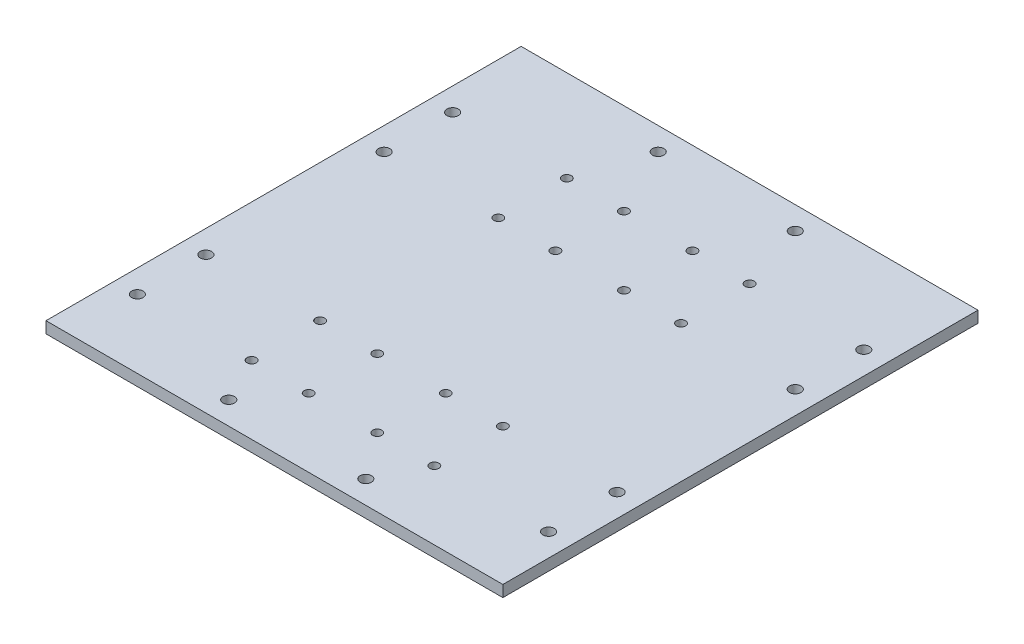
ISO-10303-21;
HEADER;
FILE_DESCRIPTION(('STEP AP214'),'2;1');
FILE_NAME('part.step','',(''),(''),'','','');
FILE_SCHEMA(('AUTOMOTIVE_DESIGN { 1 0 10303 214 1 1 1 1 }'));
ENDSEC;
DATA;
#1=APPLICATION_CONTEXT('core data for automotive mechanical design processes');
#2=APPLICATION_PROTOCOL_DEFINITION('international standard','automotive_design',2000,#1);
#3=PRODUCT_CONTEXT('',#1,'mechanical');
#4=PRODUCT('Part','Part','',(#3));
#5=PRODUCT_RELATED_PRODUCT_CATEGORY('part','',(#4));
#6=PRODUCT_DEFINITION_FORMATION('','',#4);
#7=PRODUCT_DEFINITION_CONTEXT('part definition',#1,'design');
#8=PRODUCT_DEFINITION('design','',#6,#7);
#9=PRODUCT_DEFINITION_SHAPE('','',#8);
#10=(LENGTH_UNIT() NAMED_UNIT(*) SI_UNIT(.MILLI.,.METRE.));
#11=(NAMED_UNIT(*) PLANE_ANGLE_UNIT() SI_UNIT($,.RADIAN.));
#12=(NAMED_UNIT(*) SI_UNIT($,.STERADIAN.) SOLID_ANGLE_UNIT());
#13=UNCERTAINTY_MEASURE_WITH_UNIT(LENGTH_MEASURE(1.E-05),#10,'distance_accuracy_value','');
#14=(GEOMETRIC_REPRESENTATION_CONTEXT(3) GLOBAL_UNCERTAINTY_ASSIGNED_CONTEXT((#13)) GLOBAL_UNIT_ASSIGNED_CONTEXT((#10,
#11,#12)) REPRESENTATION_CONTEXT('',''));
#15=CARTESIAN_POINT('',(0.,0.,0.));
#16=DIRECTION('',(0.,0.,1.));
#17=DIRECTION('',(1.,0.,0.));
#18=AXIS2_PLACEMENT_3D('',#15,#16,#17);
#19=CARTESIAN_POINT('',(0.,5.,0.));
#20=DIRECTION('',(1.,0.,0.));
#21=DIRECTION('',(0.,0.,-1.));
#22=AXIS2_PLACEMENT_3D('',#19,#20,#21);
#23=PLANE('',#22);
#24=DIRECTION('',(0.,0.,1.));
#25=VECTOR('',#24,1.);
#26=CARTESIAN_POINT('',(0.,0.,0.));
#27=LINE('',#26,#25);
#28=CARTESIAN_POINT('',(0.,0.,-208.));
#29=VERTEX_POINT('',#28);
#30=CARTESIAN_POINT('',(0.,0.,0.));
#31=VERTEX_POINT('',#30);
#32=EDGE_CURVE('E98',#29,#31,#27,.T.);
#33=ORIENTED_EDGE('',*,*,#32,.T.);
#34=DIRECTION('',(0.,-1.,0.));
#35=VECTOR('',#34,1.);
#36=CARTESIAN_POINT('',(0.,5.,0.));
#37=LINE('',#36,#35);
#38=CARTESIAN_POINT('',(0.,5.,0.));
#39=VERTEX_POINT('',#38);
#40=EDGE_CURVE('E11',#39,#31,#37,.T.);
#41=ORIENTED_EDGE('',*,*,#40,.F.);
#42=DIRECTION('',(0.,0.,1.));
#43=VECTOR('',#42,1.);
#44=CARTESIAN_POINT('',(0.,5.,0.));
#45=LINE('',#44,#43);
#46=CARTESIAN_POINT('',(0.,5.,-208.));
#47=VERTEX_POINT('',#46);
#48=EDGE_CURVE('E86',#47,#39,#45,.T.);
#49=ORIENTED_EDGE('',*,*,#48,.F.);
#50=DIRECTION('',(0.,-1.,0.));
#51=VECTOR('',#50,1.);
#52=CARTESIAN_POINT('',(0.,5.,-208.));
#53=LINE('',#52,#51);
#54=EDGE_CURVE('E94',#47,#29,#53,.T.);
#55=ORIENTED_EDGE('',*,*,#54,.T.);
#56=EDGE_LOOP('',(#33,#41,#49,#55));
#57=FACE_BOUND('',#56,.T.);
#58=ADVANCED_FACE('F35',(#57),#23,.F.);
#59=CARTESIAN_POINT('',(0.,5.,0.));
#60=DIRECTION('',(0.,0.,-1.));
#61=DIRECTION('',(-1.,0.,0.));
#62=AXIS2_PLACEMENT_3D('',#59,#60,#61);
#63=PLANE('',#62);
#64=DIRECTION('',(1.,0.,0.));
#65=VECTOR('',#64,1.);
#66=CARTESIAN_POINT('',(0.,0.,0.));
#67=LINE('',#66,#65);
#68=CARTESIAN_POINT('',(200.,0.,0.));
#69=VERTEX_POINT('',#68);
#70=EDGE_CURVE('E90',#31,#69,#67,.T.);
#71=ORIENTED_EDGE('',*,*,#70,.T.);
#72=DIRECTION('',(0.,-1.,0.));
#73=VECTOR('',#72,1.);
#74=CARTESIAN_POINT('',(200.,5.,0.));
#75=LINE('',#74,#73);
#76=CARTESIAN_POINT('',(200.,5.,0.));
#77=VERTEX_POINT('',#76);
#78=EDGE_CURVE('E43',#77,#69,#75,.T.);
#79=ORIENTED_EDGE('',*,*,#78,.F.);
#80=DIRECTION('',(1.,0.,0.));
#81=VECTOR('',#80,1.);
#82=CARTESIAN_POINT('',(0.,5.,0.));
#83=LINE('',#82,#81);
#84=EDGE_CURVE('E81',#39,#77,#83,.T.);
#85=ORIENTED_EDGE('',*,*,#84,.F.);
#86=ORIENTED_EDGE('',*,*,#40,.T.);
#87=EDGE_LOOP('',(#71,#79,#85,#86));
#88=FACE_BOUND('',#87,.T.);
#89=ADVANCED_FACE('F89',(#88),#63,.F.);
#90=CARTESIAN_POINT('',(200.,5.,0.));
#91=DIRECTION('',(-1.,0.,0.));
#92=DIRECTION('',(0.,0.,1.));
#93=AXIS2_PLACEMENT_3D('',#90,#91,#92);
#94=PLANE('',#93);
#95=DIRECTION('',(0.,0.,-1.));
#96=VECTOR('',#95,1.);
#97=CARTESIAN_POINT('',(200.,0.,0.));
#98=LINE('',#97,#96);
#99=CARTESIAN_POINT('',(200.,0.,-208.));
#100=VERTEX_POINT('',#99);
#101=EDGE_CURVE('E68',#69,#100,#98,.T.);
#102=ORIENTED_EDGE('',*,*,#101,.T.);
#103=DIRECTION('',(0.,-1.,0.));
#104=VECTOR('',#103,1.);
#105=CARTESIAN_POINT('',(200.,5.,-208.));
#106=LINE('',#105,#104);
#107=CARTESIAN_POINT('',(200.,5.,-208.));
#108=VERTEX_POINT('',#107);
#109=EDGE_CURVE('E91',#108,#100,#106,.T.);
#110=ORIENTED_EDGE('',*,*,#109,.F.);
#111=DIRECTION('',(0.,0.,-1.));
#112=VECTOR('',#111,1.);
#113=CARTESIAN_POINT('',(200.,5.,0.));
#114=LINE('',#113,#112);
#115=EDGE_CURVE('E84',#77,#108,#114,.T.);
#116=ORIENTED_EDGE('',*,*,#115,.F.);
#117=ORIENTED_EDGE('',*,*,#78,.T.);
#118=EDGE_LOOP('',(#102,#110,#116,#117));
#119=FACE_BOUND('',#118,.T.);
#120=ADVANCED_FACE('F92',(#119),#94,.F.);
#121=CARTESIAN_POINT('',(0.,5.,-208.));
#122=DIRECTION('',(0.,0.,1.));
#123=DIRECTION('',(1.,0.,0.));
#124=AXIS2_PLACEMENT_3D('',#121,#122,#123);
#125=PLANE('',#124);
#126=DIRECTION('',(-1.,0.,0.));
#127=VECTOR('',#126,1.);
#128=CARTESIAN_POINT('',(0.,0.,-208.));
#129=LINE('',#128,#127);
#130=EDGE_CURVE('E74',#100,#29,#129,.T.);
#131=ORIENTED_EDGE('',*,*,#130,.T.);
#132=ORIENTED_EDGE('',*,*,#54,.F.);
#133=DIRECTION('',(-1.,0.,0.));
#134=VECTOR('',#133,1.);
#135=CARTESIAN_POINT('',(0.,5.,-208.));
#136=LINE('',#135,#134);
#137=EDGE_CURVE('E51',#108,#47,#136,.T.);
#138=ORIENTED_EDGE('',*,*,#137,.F.);
#139=ORIENTED_EDGE('',*,*,#109,.T.);
#140=EDGE_LOOP('',(#131,#132,#138,#139));
#141=FACE_BOUND('',#140,.T.);
#142=ADVANCED_FACE('F106',(#141),#125,.F.);
#143=CARTESIAN_POINT('',(0.,5.,0.));
#144=DIRECTION('',(0.,-1.,0.));
#145=DIRECTION('',(0.,0.,-1.));
#146=AXIS2_PLACEMENT_3D('',#143,#144,#145);
#147=PLANE('',#146);
#148=CARTESIAN_POINT('',(10.,5.,-168.));
#149=DIRECTION('',(0.,1.,0.));
#150=DIRECTION('',(0.,0.,1.));
#151=AXIS2_PLACEMENT_3D('',#148,#149,#150);
#152=CIRCLE('',#151,2.5);
#153=CARTESIAN_POINT('',(10.,5.,-165.5));
#154=VERTEX_POINT('',#153);
#155=EDGE_CURVE('E276',#154,#154,#152,.T.);
#156=ORIENTED_EDGE('',*,*,#155,.F.);
#157=EDGE_LOOP('',(#156));
#158=FACE_BOUND('',#157,.T.);
#159=CARTESIAN_POINT('',(10.,5.,-138.));
#160=DIRECTION('',(0.,1.,0.));
#161=DIRECTION('',(0.,0.,1.));
#162=AXIS2_PLACEMENT_3D('',#159,#160,#161);
#163=CIRCLE('',#162,2.5);
#164=CARTESIAN_POINT('',(10.,5.,-135.5));
#165=VERTEX_POINT('',#164);
#166=EDGE_CURVE('E270',#165,#165,#163,.T.);
#167=ORIENTED_EDGE('',*,*,#166,.F.);
#168=EDGE_LOOP('',(#167));
#169=FACE_BOUND('',#168,.T.);
#170=CARTESIAN_POINT('',(10.,5.,-60.));
#171=DIRECTION('',(0.,1.,0.));
#172=DIRECTION('',(0.,0.,1.));
#173=AXIS2_PLACEMENT_3D('',#170,#171,#172);
#174=CIRCLE('',#173,2.5);
#175=CARTESIAN_POINT('',(10.,5.,-57.5));
#176=VERTEX_POINT('',#175);
#177=EDGE_CURVE('E264',#176,#176,#174,.T.);
#178=ORIENTED_EDGE('',*,*,#177,.F.);
#179=EDGE_LOOP('',(#178));
#180=FACE_BOUND('',#179,.T.);
#181=CARTESIAN_POINT('',(10.,5.,-30.));
#182=DIRECTION('',(0.,1.,0.));
#183=DIRECTION('',(0.,0.,1.));
#184=AXIS2_PLACEMENT_3D('',#181,#182,#183);
#185=CIRCLE('',#184,2.5);
#186=CARTESIAN_POINT('',(10.,5.,-27.5));
#187=VERTEX_POINT('',#186);
#188=EDGE_CURVE('E258',#187,#187,#185,.T.);
#189=ORIENTED_EDGE('',*,*,#188,.F.);
#190=EDGE_LOOP('',(#189));
#191=FACE_BOUND('',#190,.T.);
#192=CARTESIAN_POINT('',(70.,5.,-198.));
#193=DIRECTION('',(0.,1.,0.));
#194=DIRECTION('',(0.,0.,1.));
#195=AXIS2_PLACEMENT_3D('',#192,#193,#194);
#196=CIRCLE('',#195,2.5);
#197=CARTESIAN_POINT('',(70.,5.,-195.5));
#198=VERTEX_POINT('',#197);
#199=EDGE_CURVE('E252',#198,#198,#196,.T.);
#200=ORIENTED_EDGE('',*,*,#199,.F.);
#201=EDGE_LOOP('',(#200));
#202=FACE_BOUND('',#201,.T.);
#203=CARTESIAN_POINT('',(70.,5.,-10.));
#204=DIRECTION('',(0.,1.,0.));
#205=DIRECTION('',(0.,0.,1.));
#206=AXIS2_PLACEMENT_3D('',#203,#204,#205);
#207=CIRCLE('',#206,2.5);
#208=CARTESIAN_POINT('',(70.,5.,-7.5));
#209=VERTEX_POINT('',#208);
#210=EDGE_CURVE('E246',#209,#209,#207,.T.);
#211=ORIENTED_EDGE('',*,*,#210,.F.);
#212=EDGE_LOOP('',(#211));
#213=FACE_BOUND('',#212,.T.);
#214=CARTESIAN_POINT('',(130.,5.,-10.0000000000001));
#215=DIRECTION('',(0.,1.,0.));
#216=DIRECTION('',(0.,0.,1.));
#217=AXIS2_PLACEMENT_3D('',#214,#215,#216);
#218=CIRCLE('',#217,2.5);
#219=CARTESIAN_POINT('',(130.,5.,-7.50000000000011));
#220=VERTEX_POINT('',#219);
#221=EDGE_CURVE('E240',#220,#220,#218,.T.);
#222=ORIENTED_EDGE('',*,*,#221,.F.);
#223=EDGE_LOOP('',(#222));
#224=FACE_BOUND('',#223,.T.);
#225=CARTESIAN_POINT('',(130.,5.,-198.));
#226=DIRECTION('',(0.,1.,0.));
#227=DIRECTION('',(0.,0.,1.));
#228=AXIS2_PLACEMENT_3D('',#225,#226,#227);
#229=CIRCLE('',#228,2.5);
#230=CARTESIAN_POINT('',(130.,5.,-195.5));
#231=VERTEX_POINT('',#230);
#232=EDGE_CURVE('E234',#231,#231,#229,.T.);
#233=ORIENTED_EDGE('',*,*,#232,.F.);
#234=EDGE_LOOP('',(#233));
#235=FACE_BOUND('',#234,.T.);
#236=CARTESIAN_POINT('',(190.,5.,-30.));
#237=DIRECTION('',(0.,1.,0.));
#238=DIRECTION('',(0.,0.,1.));
#239=AXIS2_PLACEMENT_3D('',#236,#237,#238);
#240=CIRCLE('',#239,2.5);
#241=CARTESIAN_POINT('',(190.,5.,-27.5));
#242=VERTEX_POINT('',#241);
#243=EDGE_CURVE('E228',#242,#242,#240,.T.);
#244=ORIENTED_EDGE('',*,*,#243,.F.);
#245=EDGE_LOOP('',(#244));
#246=FACE_BOUND('',#245,.T.);
#247=CARTESIAN_POINT('',(190.,5.,-60.));
#248=DIRECTION('',(0.,1.,0.));
#249=DIRECTION('',(0.,0.,1.));
#250=AXIS2_PLACEMENT_3D('',#247,#248,#249);
#251=CIRCLE('',#250,2.5);
#252=CARTESIAN_POINT('',(190.,5.,-57.5));
#253=VERTEX_POINT('',#252);
#254=EDGE_CURVE('E222',#253,#253,#251,.T.);
#255=ORIENTED_EDGE('',*,*,#254,.F.);
#256=EDGE_LOOP('',(#255));
#257=FACE_BOUND('',#256,.T.);
#258=CARTESIAN_POINT('',(190.,5.,-138.));
#259=DIRECTION('',(0.,1.,0.));
#260=DIRECTION('',(0.,0.,1.));
#261=AXIS2_PLACEMENT_3D('',#258,#259,#260);
#262=CIRCLE('',#261,2.5);
#263=CARTESIAN_POINT('',(190.,5.,-135.5));
#264=VERTEX_POINT('',#263);
#265=EDGE_CURVE('E216',#264,#264,#262,.T.);
#266=ORIENTED_EDGE('',*,*,#265,.F.);
#267=EDGE_LOOP('',(#266));
#268=FACE_BOUND('',#267,.T.);
#269=CARTESIAN_POINT('',(190.,5.,-168.));
#270=DIRECTION('',(0.,1.,0.));
#271=DIRECTION('',(0.,0.,1.));
#272=AXIS2_PLACEMENT_3D('',#269,#270,#271);
#273=CIRCLE('',#272,2.5);
#274=CARTESIAN_POINT('',(190.,5.,-165.5));
#275=VERTEX_POINT('',#274);
#276=EDGE_CURVE('E210',#275,#275,#273,.T.);
#277=ORIENTED_EDGE('',*,*,#276,.F.);
#278=EDGE_LOOP('',(#277));
#279=FACE_BOUND('',#278,.T.);
#280=CARTESIAN_POINT('',(60.,5.,-168.));
#281=DIRECTION('',(0.,1.,0.));
#282=DIRECTION('',(0.,0.,1.));
#283=AXIS2_PLACEMENT_3D('',#280,#281,#282);
#284=CIRCLE('',#283,2.);
#285=CARTESIAN_POINT('',(60.,5.,-166.));
#286=VERTEX_POINT('',#285);
#287=EDGE_CURVE('E204',#286,#286,#284,.T.);
#288=ORIENTED_EDGE('',*,*,#287,.F.);
#289=EDGE_LOOP('',(#288));
#290=FACE_BOUND('',#289,.T.);
#291=CARTESIAN_POINT('',(85.,5.,-168.));
#292=DIRECTION('',(0.,1.,0.));
#293=DIRECTION('',(0.,0.,1.));
#294=AXIS2_PLACEMENT_3D('',#291,#292,#293);
#295=CIRCLE('',#294,2.);
#296=CARTESIAN_POINT('',(85.,5.,-166.));
#297=VERTEX_POINT('',#296);
#298=EDGE_CURVE('E198',#297,#297,#295,.T.);
#299=ORIENTED_EDGE('',*,*,#298,.F.);
#300=EDGE_LOOP('',(#299));
#301=FACE_BOUND('',#300,.T.);
#302=CARTESIAN_POINT('',(60.,5.,-138.));
#303=DIRECTION('',(0.,1.,0.));
#304=DIRECTION('',(0.,0.,1.));
#305=AXIS2_PLACEMENT_3D('',#302,#303,#304);
#306=CIRCLE('',#305,2.);
#307=CARTESIAN_POINT('',(60.,5.,-136.));
#308=VERTEX_POINT('',#307);
#309=EDGE_CURVE('E192',#308,#308,#306,.T.);
#310=ORIENTED_EDGE('',*,*,#309,.F.);
#311=EDGE_LOOP('',(#310));
#312=FACE_BOUND('',#311,.T.);
#313=CARTESIAN_POINT('',(85.,5.,-138.));
#314=DIRECTION('',(0.,1.,0.));
#315=DIRECTION('',(0.,0.,1.));
#316=AXIS2_PLACEMENT_3D('',#313,#314,#315);
#317=CIRCLE('',#316,2.);
#318=CARTESIAN_POINT('',(85.,5.,-136.));
#319=VERTEX_POINT('',#318);
#320=EDGE_CURVE('E186',#319,#319,#317,.T.);
#321=ORIENTED_EDGE('',*,*,#320,.F.);
#322=EDGE_LOOP('',(#321));
#323=FACE_BOUND('',#322,.T.);
#324=CARTESIAN_POINT('',(60.,5.,-60.));
#325=DIRECTION('',(0.,1.,0.));
#326=DIRECTION('',(0.,0.,1.));
#327=AXIS2_PLACEMENT_3D('',#324,#325,#326);
#328=CIRCLE('',#327,2.);
#329=CARTESIAN_POINT('',(60.,5.,-58.));
#330=VERTEX_POINT('',#329);
#331=EDGE_CURVE('E180',#330,#330,#328,.T.);
#332=ORIENTED_EDGE('',*,*,#331,.F.);
#333=EDGE_LOOP('',(#332));
#334=FACE_BOUND('',#333,.T.);
#335=CARTESIAN_POINT('',(85.,5.,-60.));
#336=DIRECTION('',(0.,1.,0.));
#337=DIRECTION('',(0.,0.,1.));
#338=AXIS2_PLACEMENT_3D('',#335,#336,#337);
#339=CIRCLE('',#338,2.);
#340=CARTESIAN_POINT('',(85.,5.,-58.));
#341=VERTEX_POINT('',#340);
#342=EDGE_CURVE('E174',#341,#341,#339,.T.);
#343=ORIENTED_EDGE('',*,*,#342,.F.);
#344=EDGE_LOOP('',(#343));
#345=FACE_BOUND('',#344,.T.);
#346=CARTESIAN_POINT('',(60.,5.,-30.));
#347=DIRECTION('',(0.,1.,0.));
#348=DIRECTION('',(0.,0.,1.));
#349=AXIS2_PLACEMENT_3D('',#346,#347,#348);
#350=CIRCLE('',#349,2.);
#351=CARTESIAN_POINT('',(60.,5.,-28.));
#352=VERTEX_POINT('',#351);
#353=EDGE_CURVE('E168',#352,#352,#350,.T.);
#354=ORIENTED_EDGE('',*,*,#353,.F.);
#355=EDGE_LOOP('',(#354));
#356=FACE_BOUND('',#355,.T.);
#357=CARTESIAN_POINT('',(85.,5.,-30.));
#358=DIRECTION('',(0.,1.,0.));
#359=DIRECTION('',(0.,0.,1.));
#360=AXIS2_PLACEMENT_3D('',#357,#358,#359);
#361=CIRCLE('',#360,2.);
#362=CARTESIAN_POINT('',(85.,5.,-28.));
#363=VERTEX_POINT('',#362);
#364=EDGE_CURVE('E162',#363,#363,#361,.T.);
#365=ORIENTED_EDGE('',*,*,#364,.F.);
#366=EDGE_LOOP('',(#365));
#367=FACE_BOUND('',#366,.T.);
#368=CARTESIAN_POINT('',(115.,5.,-30.0000000000001));
#369=DIRECTION('',(0.,1.,0.));
#370=DIRECTION('',(0.,0.,1.));
#371=AXIS2_PLACEMENT_3D('',#368,#369,#370);
#372=CIRCLE('',#371,2.);
#373=CARTESIAN_POINT('',(115.,5.,-28.0000000000001));
#374=VERTEX_POINT('',#373);
#375=EDGE_CURVE('E156',#374,#374,#372,.T.);
#376=ORIENTED_EDGE('',*,*,#375,.F.);
#377=EDGE_LOOP('',(#376));
#378=FACE_BOUND('',#377,.T.);
#379=CARTESIAN_POINT('',(140.,5.,-30.0000000000001));
#380=DIRECTION('',(0.,1.,0.));
#381=DIRECTION('',(0.,0.,1.));
#382=AXIS2_PLACEMENT_3D('',#379,#380,#381);
#383=CIRCLE('',#382,2.);
#384=CARTESIAN_POINT('',(140.,5.,-28.0000000000001));
#385=VERTEX_POINT('',#384);
#386=EDGE_CURVE('E150',#385,#385,#383,.T.);
#387=ORIENTED_EDGE('',*,*,#386,.F.);
#388=EDGE_LOOP('',(#387));
#389=FACE_BOUND('',#388,.T.);
#390=CARTESIAN_POINT('',(115.,5.,-60.0000000000001));
#391=DIRECTION('',(0.,1.,0.));
#392=DIRECTION('',(0.,0.,1.));
#393=AXIS2_PLACEMENT_3D('',#390,#391,#392);
#394=CIRCLE('',#393,2.);
#395=CARTESIAN_POINT('',(115.,5.,-58.0000000000001));
#396=VERTEX_POINT('',#395);
#397=EDGE_CURVE('E144',#396,#396,#394,.T.);
#398=ORIENTED_EDGE('',*,*,#397,.F.);
#399=EDGE_LOOP('',(#398));
#400=FACE_BOUND('',#399,.T.);
#401=CARTESIAN_POINT('',(140.,5.,-60.0000000000001));
#402=DIRECTION('',(0.,1.,0.));
#403=DIRECTION('',(0.,0.,1.));
#404=AXIS2_PLACEMENT_3D('',#401,#402,#403);
#405=CIRCLE('',#404,2.);
#406=CARTESIAN_POINT('',(140.,5.,-58.0000000000001));
#407=VERTEX_POINT('',#406);
#408=EDGE_CURVE('E138',#407,#407,#405,.T.);
#409=ORIENTED_EDGE('',*,*,#408,.F.);
#410=EDGE_LOOP('',(#409));
#411=FACE_BOUND('',#410,.T.);
#412=CARTESIAN_POINT('',(115.,5.,-138.));
#413=DIRECTION('',(0.,1.,0.));
#414=DIRECTION('',(0.,0.,1.));
#415=AXIS2_PLACEMENT_3D('',#412,#413,#414);
#416=CIRCLE('',#415,2.);
#417=CARTESIAN_POINT('',(115.,5.,-136.));
#418=VERTEX_POINT('',#417);
#419=EDGE_CURVE('E132',#418,#418,#416,.T.);
#420=ORIENTED_EDGE('',*,*,#419,.F.);
#421=EDGE_LOOP('',(#420));
#422=FACE_BOUND('',#421,.T.);
#423=CARTESIAN_POINT('',(140.,5.,-138.));
#424=DIRECTION('',(0.,1.,0.));
#425=DIRECTION('',(0.,0.,1.));
#426=AXIS2_PLACEMENT_3D('',#423,#424,#425);
#427=CIRCLE('',#426,2.);
#428=CARTESIAN_POINT('',(140.,5.,-136.));
#429=VERTEX_POINT('',#428);
#430=EDGE_CURVE('E126',#429,#429,#427,.T.);
#431=ORIENTED_EDGE('',*,*,#430,.F.);
#432=EDGE_LOOP('',(#431));
#433=FACE_BOUND('',#432,.T.);
#434=CARTESIAN_POINT('',(115.,5.,-168.));
#435=DIRECTION('',(0.,1.,0.));
#436=DIRECTION('',(0.,0.,1.));
#437=AXIS2_PLACEMENT_3D('',#434,#435,#436);
#438=CIRCLE('',#437,2.);
#439=CARTESIAN_POINT('',(115.,5.,-166.));
#440=VERTEX_POINT('',#439);
#441=EDGE_CURVE('E120',#440,#440,#438,.T.);
#442=ORIENTED_EDGE('',*,*,#441,.F.);
#443=EDGE_LOOP('',(#442));
#444=FACE_BOUND('',#443,.T.);
#445=CARTESIAN_POINT('',(140.,5.,-168.));
#446=DIRECTION('',(0.,1.,0.));
#447=DIRECTION('',(0.,0.,1.));
#448=AXIS2_PLACEMENT_3D('',#445,#446,#447);
#449=CIRCLE('',#448,2.);
#450=CARTESIAN_POINT('',(140.,5.,-166.));
#451=VERTEX_POINT('',#450);
#452=EDGE_CURVE('E114',#451,#451,#449,.T.);
#453=ORIENTED_EDGE('',*,*,#452,.F.);
#454=EDGE_LOOP('',(#453));
#455=FACE_BOUND('',#454,.T.);
#456=ORIENTED_EDGE('',*,*,#48,.T.);
#457=ORIENTED_EDGE('',*,*,#84,.T.);
#458=ORIENTED_EDGE('',*,*,#115,.T.);
#459=ORIENTED_EDGE('',*,*,#137,.T.);
#460=EDGE_LOOP('',(#456,#457,#458,#459));
#461=FACE_BOUND('',#460,.T.);
#462=ADVANCED_FACE('F82',(#158,#169,#180,#191,#202,#213,#224,#235,#246,#257,#268,#279,#290,#301,
#312,#323,#334,#345,#356,#367,#378,#389,#400,#411,#422,#433,#444,#455,#461),#147,.F.);
#463=CARTESIAN_POINT('',(0.,0.,0.));
#464=DIRECTION('',(0.,-1.,0.));
#465=DIRECTION('',(0.,0.,-1.));
#466=AXIS2_PLACEMENT_3D('',#463,#464,#465);
#467=PLANE('',#466);
#468=CARTESIAN_POINT('',(10.,0.,-168.));
#469=DIRECTION('',(0.,1.,0.));
#470=DIRECTION('',(0.,0.,1.));
#471=AXIS2_PLACEMENT_3D('',#468,#469,#470);
#472=CIRCLE('',#471,2.5);
#473=CARTESIAN_POINT('',(10.,0.,-165.5));
#474=VERTEX_POINT('',#473);
#475=EDGE_CURVE('E273',#474,#474,#472,.T.);
#476=ORIENTED_EDGE('',*,*,#475,.T.);
#477=EDGE_LOOP('',(#476));
#478=FACE_BOUND('',#477,.T.);
#479=CARTESIAN_POINT('',(10.,0.,-138.));
#480=DIRECTION('',(0.,1.,0.));
#481=DIRECTION('',(0.,0.,1.));
#482=AXIS2_PLACEMENT_3D('',#479,#480,#481);
#483=CIRCLE('',#482,2.5);
#484=CARTESIAN_POINT('',(10.,0.,-135.5));
#485=VERTEX_POINT('',#484);
#486=EDGE_CURVE('E267',#485,#485,#483,.T.);
#487=ORIENTED_EDGE('',*,*,#486,.T.);
#488=EDGE_LOOP('',(#487));
#489=FACE_BOUND('',#488,.T.);
#490=CARTESIAN_POINT('',(10.,0.,-60.));
#491=DIRECTION('',(0.,1.,0.));
#492=DIRECTION('',(0.,0.,1.));
#493=AXIS2_PLACEMENT_3D('',#490,#491,#492);
#494=CIRCLE('',#493,2.5);
#495=CARTESIAN_POINT('',(10.,0.,-57.5));
#496=VERTEX_POINT('',#495);
#497=EDGE_CURVE('E261',#496,#496,#494,.T.);
#498=ORIENTED_EDGE('',*,*,#497,.T.);
#499=EDGE_LOOP('',(#498));
#500=FACE_BOUND('',#499,.T.);
#501=CARTESIAN_POINT('',(10.,0.,-30.));
#502=DIRECTION('',(0.,1.,0.));
#503=DIRECTION('',(0.,0.,1.));
#504=AXIS2_PLACEMENT_3D('',#501,#502,#503);
#505=CIRCLE('',#504,2.5);
#506=CARTESIAN_POINT('',(10.,0.,-27.5));
#507=VERTEX_POINT('',#506);
#508=EDGE_CURVE('E255',#507,#507,#505,.T.);
#509=ORIENTED_EDGE('',*,*,#508,.T.);
#510=EDGE_LOOP('',(#509));
#511=FACE_BOUND('',#510,.T.);
#512=CARTESIAN_POINT('',(70.,0.,-198.));
#513=DIRECTION('',(0.,1.,0.));
#514=DIRECTION('',(0.,0.,1.));
#515=AXIS2_PLACEMENT_3D('',#512,#513,#514);
#516=CIRCLE('',#515,2.5);
#517=CARTESIAN_POINT('',(70.,0.,-195.5));
#518=VERTEX_POINT('',#517);
#519=EDGE_CURVE('E249',#518,#518,#516,.T.);
#520=ORIENTED_EDGE('',*,*,#519,.T.);
#521=EDGE_LOOP('',(#520));
#522=FACE_BOUND('',#521,.T.);
#523=CARTESIAN_POINT('',(70.,0.,-10.));
#524=DIRECTION('',(0.,1.,0.));
#525=DIRECTION('',(0.,0.,1.));
#526=AXIS2_PLACEMENT_3D('',#523,#524,#525);
#527=CIRCLE('',#526,2.5);
#528=CARTESIAN_POINT('',(70.,0.,-7.5));
#529=VERTEX_POINT('',#528);
#530=EDGE_CURVE('E243',#529,#529,#527,.T.);
#531=ORIENTED_EDGE('',*,*,#530,.T.);
#532=EDGE_LOOP('',(#531));
#533=FACE_BOUND('',#532,.T.);
#534=CARTESIAN_POINT('',(130.,0.,-10.0000000000001));
#535=DIRECTION('',(0.,1.,0.));
#536=DIRECTION('',(0.,0.,1.));
#537=AXIS2_PLACEMENT_3D('',#534,#535,#536);
#538=CIRCLE('',#537,2.5);
#539=CARTESIAN_POINT('',(130.,0.,-7.50000000000011));
#540=VERTEX_POINT('',#539);
#541=EDGE_CURVE('E237',#540,#540,#538,.T.);
#542=ORIENTED_EDGE('',*,*,#541,.T.);
#543=EDGE_LOOP('',(#542));
#544=FACE_BOUND('',#543,.T.);
#545=CARTESIAN_POINT('',(130.,0.,-198.));
#546=DIRECTION('',(0.,1.,0.));
#547=DIRECTION('',(0.,0.,1.));
#548=AXIS2_PLACEMENT_3D('',#545,#546,#547);
#549=CIRCLE('',#548,2.5);
#550=CARTESIAN_POINT('',(130.,0.,-195.5));
#551=VERTEX_POINT('',#550);
#552=EDGE_CURVE('E231',#551,#551,#549,.T.);
#553=ORIENTED_EDGE('',*,*,#552,.T.);
#554=EDGE_LOOP('',(#553));
#555=FACE_BOUND('',#554,.T.);
#556=CARTESIAN_POINT('',(190.,0.,-30.));
#557=DIRECTION('',(0.,1.,0.));
#558=DIRECTION('',(0.,0.,1.));
#559=AXIS2_PLACEMENT_3D('',#556,#557,#558);
#560=CIRCLE('',#559,2.5);
#561=CARTESIAN_POINT('',(190.,0.,-27.5));
#562=VERTEX_POINT('',#561);
#563=EDGE_CURVE('E225',#562,#562,#560,.T.);
#564=ORIENTED_EDGE('',*,*,#563,.T.);
#565=EDGE_LOOP('',(#564));
#566=FACE_BOUND('',#565,.T.);
#567=CARTESIAN_POINT('',(190.,0.,-60.));
#568=DIRECTION('',(0.,1.,0.));
#569=DIRECTION('',(0.,0.,1.));
#570=AXIS2_PLACEMENT_3D('',#567,#568,#569);
#571=CIRCLE('',#570,2.5);
#572=CARTESIAN_POINT('',(190.,0.,-57.5));
#573=VERTEX_POINT('',#572);
#574=EDGE_CURVE('E219',#573,#573,#571,.T.);
#575=ORIENTED_EDGE('',*,*,#574,.T.);
#576=EDGE_LOOP('',(#575));
#577=FACE_BOUND('',#576,.T.);
#578=CARTESIAN_POINT('',(190.,0.,-138.));
#579=DIRECTION('',(0.,1.,0.));
#580=DIRECTION('',(0.,0.,1.));
#581=AXIS2_PLACEMENT_3D('',#578,#579,#580);
#582=CIRCLE('',#581,2.5);
#583=CARTESIAN_POINT('',(190.,0.,-135.5));
#584=VERTEX_POINT('',#583);
#585=EDGE_CURVE('E213',#584,#584,#582,.T.);
#586=ORIENTED_EDGE('',*,*,#585,.T.);
#587=EDGE_LOOP('',(#586));
#588=FACE_BOUND('',#587,.T.);
#589=CARTESIAN_POINT('',(190.,0.,-168.));
#590=DIRECTION('',(0.,1.,0.));
#591=DIRECTION('',(0.,0.,1.));
#592=AXIS2_PLACEMENT_3D('',#589,#590,#591);
#593=CIRCLE('',#592,2.5);
#594=CARTESIAN_POINT('',(190.,0.,-165.5));
#595=VERTEX_POINT('',#594);
#596=EDGE_CURVE('E207',#595,#595,#593,.T.);
#597=ORIENTED_EDGE('',*,*,#596,.T.);
#598=EDGE_LOOP('',(#597));
#599=FACE_BOUND('',#598,.T.);
#600=CARTESIAN_POINT('',(60.,0.,-168.));
#601=DIRECTION('',(0.,1.,0.));
#602=DIRECTION('',(0.,0.,1.));
#603=AXIS2_PLACEMENT_3D('',#600,#601,#602);
#604=CIRCLE('',#603,2.);
#605=CARTESIAN_POINT('',(60.,0.,-166.));
#606=VERTEX_POINT('',#605);
#607=EDGE_CURVE('E201',#606,#606,#604,.T.);
#608=ORIENTED_EDGE('',*,*,#607,.T.);
#609=EDGE_LOOP('',(#608));
#610=FACE_BOUND('',#609,.T.);
#611=CARTESIAN_POINT('',(85.,0.,-168.));
#612=DIRECTION('',(0.,1.,0.));
#613=DIRECTION('',(0.,0.,1.));
#614=AXIS2_PLACEMENT_3D('',#611,#612,#613);
#615=CIRCLE('',#614,2.);
#616=CARTESIAN_POINT('',(85.,0.,-166.));
#617=VERTEX_POINT('',#616);
#618=EDGE_CURVE('E195',#617,#617,#615,.T.);
#619=ORIENTED_EDGE('',*,*,#618,.T.);
#620=EDGE_LOOP('',(#619));
#621=FACE_BOUND('',#620,.T.);
#622=CARTESIAN_POINT('',(60.,0.,-138.));
#623=DIRECTION('',(0.,1.,0.));
#624=DIRECTION('',(0.,0.,1.));
#625=AXIS2_PLACEMENT_3D('',#622,#623,#624);
#626=CIRCLE('',#625,2.);
#627=CARTESIAN_POINT('',(60.,0.,-136.));
#628=VERTEX_POINT('',#627);
#629=EDGE_CURVE('E189',#628,#628,#626,.T.);
#630=ORIENTED_EDGE('',*,*,#629,.T.);
#631=EDGE_LOOP('',(#630));
#632=FACE_BOUND('',#631,.T.);
#633=CARTESIAN_POINT('',(85.,0.,-138.));
#634=DIRECTION('',(0.,1.,0.));
#635=DIRECTION('',(0.,0.,1.));
#636=AXIS2_PLACEMENT_3D('',#633,#634,#635);
#637=CIRCLE('',#636,2.);
#638=CARTESIAN_POINT('',(85.,0.,-136.));
#639=VERTEX_POINT('',#638);
#640=EDGE_CURVE('E183',#639,#639,#637,.T.);
#641=ORIENTED_EDGE('',*,*,#640,.T.);
#642=EDGE_LOOP('',(#641));
#643=FACE_BOUND('',#642,.T.);
#644=CARTESIAN_POINT('',(60.,0.,-60.));
#645=DIRECTION('',(0.,1.,0.));
#646=DIRECTION('',(0.,0.,1.));
#647=AXIS2_PLACEMENT_3D('',#644,#645,#646);
#648=CIRCLE('',#647,2.);
#649=CARTESIAN_POINT('',(60.,0.,-58.));
#650=VERTEX_POINT('',#649);
#651=EDGE_CURVE('E177',#650,#650,#648,.T.);
#652=ORIENTED_EDGE('',*,*,#651,.T.);
#653=EDGE_LOOP('',(#652));
#654=FACE_BOUND('',#653,.T.);
#655=CARTESIAN_POINT('',(85.,0.,-60.));
#656=DIRECTION('',(0.,1.,0.));
#657=DIRECTION('',(0.,0.,1.));
#658=AXIS2_PLACEMENT_3D('',#655,#656,#657);
#659=CIRCLE('',#658,2.);
#660=CARTESIAN_POINT('',(85.,0.,-58.));
#661=VERTEX_POINT('',#660);
#662=EDGE_CURVE('E171',#661,#661,#659,.T.);
#663=ORIENTED_EDGE('',*,*,#662,.T.);
#664=EDGE_LOOP('',(#663));
#665=FACE_BOUND('',#664,.T.);
#666=CARTESIAN_POINT('',(60.,0.,-30.));
#667=DIRECTION('',(0.,1.,0.));
#668=DIRECTION('',(0.,0.,1.));
#669=AXIS2_PLACEMENT_3D('',#666,#667,#668);
#670=CIRCLE('',#669,2.);
#671=CARTESIAN_POINT('',(60.,0.,-28.));
#672=VERTEX_POINT('',#671);
#673=EDGE_CURVE('E165',#672,#672,#670,.T.);
#674=ORIENTED_EDGE('',*,*,#673,.T.);
#675=EDGE_LOOP('',(#674));
#676=FACE_BOUND('',#675,.T.);
#677=CARTESIAN_POINT('',(85.,0.,-30.));
#678=DIRECTION('',(0.,1.,0.));
#679=DIRECTION('',(0.,0.,1.));
#680=AXIS2_PLACEMENT_3D('',#677,#678,#679);
#681=CIRCLE('',#680,2.);
#682=CARTESIAN_POINT('',(85.,0.,-28.));
#683=VERTEX_POINT('',#682);
#684=EDGE_CURVE('E159',#683,#683,#681,.T.);
#685=ORIENTED_EDGE('',*,*,#684,.T.);
#686=EDGE_LOOP('',(#685));
#687=FACE_BOUND('',#686,.T.);
#688=CARTESIAN_POINT('',(115.,0.,-30.0000000000001));
#689=DIRECTION('',(0.,1.,0.));
#690=DIRECTION('',(0.,0.,1.));
#691=AXIS2_PLACEMENT_3D('',#688,#689,#690);
#692=CIRCLE('',#691,2.);
#693=CARTESIAN_POINT('',(115.,0.,-28.0000000000001));
#694=VERTEX_POINT('',#693);
#695=EDGE_CURVE('E153',#694,#694,#692,.T.);
#696=ORIENTED_EDGE('',*,*,#695,.T.);
#697=EDGE_LOOP('',(#696));
#698=FACE_BOUND('',#697,.T.);
#699=CARTESIAN_POINT('',(140.,0.,-30.0000000000001));
#700=DIRECTION('',(0.,1.,0.));
#701=DIRECTION('',(0.,0.,1.));
#702=AXIS2_PLACEMENT_3D('',#699,#700,#701);
#703=CIRCLE('',#702,2.);
#704=CARTESIAN_POINT('',(140.,0.,-28.0000000000001));
#705=VERTEX_POINT('',#704);
#706=EDGE_CURVE('E147',#705,#705,#703,.T.);
#707=ORIENTED_EDGE('',*,*,#706,.T.);
#708=EDGE_LOOP('',(#707));
#709=FACE_BOUND('',#708,.T.);
#710=CARTESIAN_POINT('',(115.,0.,-60.0000000000001));
#711=DIRECTION('',(0.,1.,0.));
#712=DIRECTION('',(0.,0.,1.));
#713=AXIS2_PLACEMENT_3D('',#710,#711,#712);
#714=CIRCLE('',#713,2.);
#715=CARTESIAN_POINT('',(115.,0.,-58.0000000000001));
#716=VERTEX_POINT('',#715);
#717=EDGE_CURVE('E141',#716,#716,#714,.T.);
#718=ORIENTED_EDGE('',*,*,#717,.T.);
#719=EDGE_LOOP('',(#718));
#720=FACE_BOUND('',#719,.T.);
#721=CARTESIAN_POINT('',(140.,0.,-60.0000000000001));
#722=DIRECTION('',(0.,1.,0.));
#723=DIRECTION('',(0.,0.,1.));
#724=AXIS2_PLACEMENT_3D('',#721,#722,#723);
#725=CIRCLE('',#724,2.);
#726=CARTESIAN_POINT('',(140.,0.,-58.0000000000001));
#727=VERTEX_POINT('',#726);
#728=EDGE_CURVE('E135',#727,#727,#725,.T.);
#729=ORIENTED_EDGE('',*,*,#728,.T.);
#730=EDGE_LOOP('',(#729));
#731=FACE_BOUND('',#730,.T.);
#732=CARTESIAN_POINT('',(115.,0.,-138.));
#733=DIRECTION('',(0.,1.,0.));
#734=DIRECTION('',(0.,0.,1.));
#735=AXIS2_PLACEMENT_3D('',#732,#733,#734);
#736=CIRCLE('',#735,2.);
#737=CARTESIAN_POINT('',(115.,0.,-136.));
#738=VERTEX_POINT('',#737);
#739=EDGE_CURVE('E129',#738,#738,#736,.T.);
#740=ORIENTED_EDGE('',*,*,#739,.T.);
#741=EDGE_LOOP('',(#740));
#742=FACE_BOUND('',#741,.T.);
#743=CARTESIAN_POINT('',(140.,0.,-138.));
#744=DIRECTION('',(0.,1.,0.));
#745=DIRECTION('',(0.,0.,1.));
#746=AXIS2_PLACEMENT_3D('',#743,#744,#745);
#747=CIRCLE('',#746,2.);
#748=CARTESIAN_POINT('',(140.,0.,-136.));
#749=VERTEX_POINT('',#748);
#750=EDGE_CURVE('E123',#749,#749,#747,.T.);
#751=ORIENTED_EDGE('',*,*,#750,.T.);
#752=EDGE_LOOP('',(#751));
#753=FACE_BOUND('',#752,.T.);
#754=CARTESIAN_POINT('',(115.,0.,-168.));
#755=DIRECTION('',(0.,1.,0.));
#756=DIRECTION('',(0.,0.,1.));
#757=AXIS2_PLACEMENT_3D('',#754,#755,#756);
#758=CIRCLE('',#757,2.);
#759=CARTESIAN_POINT('',(115.,0.,-166.));
#760=VERTEX_POINT('',#759);
#761=EDGE_CURVE('E117',#760,#760,#758,.T.);
#762=ORIENTED_EDGE('',*,*,#761,.T.);
#763=EDGE_LOOP('',(#762));
#764=FACE_BOUND('',#763,.T.);
#765=CARTESIAN_POINT('',(140.,0.,-168.));
#766=DIRECTION('',(0.,1.,0.));
#767=DIRECTION('',(0.,0.,1.));
#768=AXIS2_PLACEMENT_3D('',#765,#766,#767);
#769=CIRCLE('',#768,2.);
#770=CARTESIAN_POINT('',(140.,0.,-166.));
#771=VERTEX_POINT('',#770);
#772=EDGE_CURVE('E101',#771,#771,#769,.T.);
#773=ORIENTED_EDGE('',*,*,#772,.T.);
#774=EDGE_LOOP('',(#773));
#775=FACE_BOUND('',#774,.T.);
#776=ORIENTED_EDGE('',*,*,#32,.F.);
#777=ORIENTED_EDGE('',*,*,#130,.F.);
#778=ORIENTED_EDGE('',*,*,#101,.F.);
#779=ORIENTED_EDGE('',*,*,#70,.F.);
#780=EDGE_LOOP('',(#776,#777,#778,#779));
#781=FACE_BOUND('',#780,.T.);
#782=ADVANCED_FACE('F109',(#478,#489,#500,#511,#522,#533,#544,#555,#566,#577,#588,#599,#610,
#621,#632,#643,#654,#665,#676,#687,#698,#709,#720,#731,#742,#753,#764,#775,#781),#467,.T.);
#783=CARTESIAN_POINT('',(140.,5.,-168.));
#784=DIRECTION('',(0.,1.,0.));
#785=DIRECTION('',(0.,0.,1.));
#786=AXIS2_PLACEMENT_3D('',#783,#784,#785);
#787=CYLINDRICAL_SURFACE('',#786,2.);
#788=ORIENTED_EDGE('',*,*,#772,.F.);
#789=EDGE_LOOP('',(#788));
#790=FACE_BOUND('',#789,.T.);
#791=ORIENTED_EDGE('',*,*,#452,.T.);
#792=EDGE_LOOP('',(#791));
#793=FACE_BOUND('',#792,.T.);
#794=ADVANCED_FACE('F339',(#790,#793),#787,.F.);
#795=CARTESIAN_POINT('',(115.,5.,-168.));
#796=DIRECTION('',(0.,1.,0.));
#797=DIRECTION('',(0.,0.,1.));
#798=AXIS2_PLACEMENT_3D('',#795,#796,#797);
#799=CYLINDRICAL_SURFACE('',#798,2.);
#800=ORIENTED_EDGE('',*,*,#761,.F.);
#801=EDGE_LOOP('',(#800));
#802=FACE_BOUND('',#801,.T.);
#803=ORIENTED_EDGE('',*,*,#441,.T.);
#804=EDGE_LOOP('',(#803));
#805=FACE_BOUND('',#804,.T.);
#806=ADVANCED_FACE('F341',(#802,#805),#799,.F.);
#807=CARTESIAN_POINT('',(140.,5.,-138.));
#808=DIRECTION('',(0.,1.,0.));
#809=DIRECTION('',(0.,0.,1.));
#810=AXIS2_PLACEMENT_3D('',#807,#808,#809);
#811=CYLINDRICAL_SURFACE('',#810,2.);
#812=ORIENTED_EDGE('',*,*,#750,.F.);
#813=EDGE_LOOP('',(#812));
#814=FACE_BOUND('',#813,.T.);
#815=ORIENTED_EDGE('',*,*,#430,.T.);
#816=EDGE_LOOP('',(#815));
#817=FACE_BOUND('',#816,.T.);
#818=ADVANCED_FACE('F348',(#814,#817),#811,.F.);
#819=CARTESIAN_POINT('',(115.,5.,-138.));
#820=DIRECTION('',(0.,1.,0.));
#821=DIRECTION('',(0.,0.,1.));
#822=AXIS2_PLACEMENT_3D('',#819,#820,#821);
#823=CYLINDRICAL_SURFACE('',#822,2.);
#824=ORIENTED_EDGE('',*,*,#739,.F.);
#825=EDGE_LOOP('',(#824));
#826=FACE_BOUND('',#825,.T.);
#827=ORIENTED_EDGE('',*,*,#419,.T.);
#828=EDGE_LOOP('',(#827));
#829=FACE_BOUND('',#828,.T.);
#830=ADVANCED_FACE('F551',(#826,#829),#823,.F.);
#831=CARTESIAN_POINT('',(140.,5.,-60.0000000000001));
#832=DIRECTION('',(0.,1.,0.));
#833=DIRECTION('',(0.,0.,1.));
#834=AXIS2_PLACEMENT_3D('',#831,#832,#833);
#835=CYLINDRICAL_SURFACE('',#834,2.);
#836=ORIENTED_EDGE('',*,*,#728,.F.);
#837=EDGE_LOOP('',(#836));
#838=FACE_BOUND('',#837,.T.);
#839=ORIENTED_EDGE('',*,*,#408,.T.);
#840=EDGE_LOOP('',(#839));
#841=FACE_BOUND('',#840,.T.);
#842=ADVANCED_FACE('F547',(#838,#841),#835,.F.);
#843=CARTESIAN_POINT('',(115.,5.,-60.0000000000001));
#844=DIRECTION('',(0.,1.,0.));
#845=DIRECTION('',(0.,0.,1.));
#846=AXIS2_PLACEMENT_3D('',#843,#844,#845);
#847=CYLINDRICAL_SURFACE('',#846,2.);
#848=ORIENTED_EDGE('',*,*,#717,.F.);
#849=EDGE_LOOP('',(#848));
#850=FACE_BOUND('',#849,.T.);
#851=ORIENTED_EDGE('',*,*,#397,.T.);
#852=EDGE_LOOP('',(#851));
#853=FACE_BOUND('',#852,.T.);
#854=ADVANCED_FACE('F543',(#850,#853),#847,.F.);
#855=CARTESIAN_POINT('',(140.,5.,-30.0000000000001));
#856=DIRECTION('',(0.,1.,0.));
#857=DIRECTION('',(0.,0.,1.));
#858=AXIS2_PLACEMENT_3D('',#855,#856,#857);
#859=CYLINDRICAL_SURFACE('',#858,2.);
#860=ORIENTED_EDGE('',*,*,#706,.F.);
#861=EDGE_LOOP('',(#860));
#862=FACE_BOUND('',#861,.T.);
#863=ORIENTED_EDGE('',*,*,#386,.T.);
#864=EDGE_LOOP('',(#863));
#865=FACE_BOUND('',#864,.T.);
#866=ADVANCED_FACE('F539',(#862,#865),#859,.F.);
#867=CARTESIAN_POINT('',(115.,5.,-30.0000000000001));
#868=DIRECTION('',(0.,1.,0.));
#869=DIRECTION('',(0.,0.,1.));
#870=AXIS2_PLACEMENT_3D('',#867,#868,#869);
#871=CYLINDRICAL_SURFACE('',#870,2.);
#872=ORIENTED_EDGE('',*,*,#695,.F.);
#873=EDGE_LOOP('',(#872));
#874=FACE_BOUND('',#873,.T.);
#875=ORIENTED_EDGE('',*,*,#375,.T.);
#876=EDGE_LOOP('',(#875));
#877=FACE_BOUND('',#876,.T.);
#878=ADVANCED_FACE('F535',(#874,#877),#871,.F.);
#879=CARTESIAN_POINT('',(85.,5.,-30.));
#880=DIRECTION('',(0.,1.,0.));
#881=DIRECTION('',(0.,0.,1.));
#882=AXIS2_PLACEMENT_3D('',#879,#880,#881);
#883=CYLINDRICAL_SURFACE('',#882,2.);
#884=ORIENTED_EDGE('',*,*,#684,.F.);
#885=EDGE_LOOP('',(#884));
#886=FACE_BOUND('',#885,.T.);
#887=ORIENTED_EDGE('',*,*,#364,.T.);
#888=EDGE_LOOP('',(#887));
#889=FACE_BOUND('',#888,.T.);
#890=ADVANCED_FACE('F531',(#886,#889),#883,.F.);
#891=CARTESIAN_POINT('',(60.,5.,-30.));
#892=DIRECTION('',(0.,1.,0.));
#893=DIRECTION('',(0.,0.,1.));
#894=AXIS2_PLACEMENT_3D('',#891,#892,#893);
#895=CYLINDRICAL_SURFACE('',#894,2.);
#896=ORIENTED_EDGE('',*,*,#673,.F.);
#897=EDGE_LOOP('',(#896));
#898=FACE_BOUND('',#897,.T.);
#899=ORIENTED_EDGE('',*,*,#353,.T.);
#900=EDGE_LOOP('',(#899));
#901=FACE_BOUND('',#900,.T.);
#902=ADVANCED_FACE('F527',(#898,#901),#895,.F.);
#903=CARTESIAN_POINT('',(85.,5.,-60.));
#904=DIRECTION('',(0.,1.,0.));
#905=DIRECTION('',(0.,0.,1.));
#906=AXIS2_PLACEMENT_3D('',#903,#904,#905);
#907=CYLINDRICAL_SURFACE('',#906,2.);
#908=ORIENTED_EDGE('',*,*,#662,.F.);
#909=EDGE_LOOP('',(#908));
#910=FACE_BOUND('',#909,.T.);
#911=ORIENTED_EDGE('',*,*,#342,.T.);
#912=EDGE_LOOP('',(#911));
#913=FACE_BOUND('',#912,.T.);
#914=ADVANCED_FACE('F523',(#910,#913),#907,.F.);
#915=CARTESIAN_POINT('',(60.,5.,-60.));
#916=DIRECTION('',(0.,1.,0.));
#917=DIRECTION('',(0.,0.,1.));
#918=AXIS2_PLACEMENT_3D('',#915,#916,#917);
#919=CYLINDRICAL_SURFACE('',#918,2.);
#920=ORIENTED_EDGE('',*,*,#651,.F.);
#921=EDGE_LOOP('',(#920));
#922=FACE_BOUND('',#921,.T.);
#923=ORIENTED_EDGE('',*,*,#331,.T.);
#924=EDGE_LOOP('',(#923));
#925=FACE_BOUND('',#924,.T.);
#926=ADVANCED_FACE('F519',(#922,#925),#919,.F.);
#927=CARTESIAN_POINT('',(85.,5.,-138.));
#928=DIRECTION('',(0.,1.,0.));
#929=DIRECTION('',(0.,0.,1.));
#930=AXIS2_PLACEMENT_3D('',#927,#928,#929);
#931=CYLINDRICAL_SURFACE('',#930,2.);
#932=ORIENTED_EDGE('',*,*,#640,.F.);
#933=EDGE_LOOP('',(#932));
#934=FACE_BOUND('',#933,.T.);
#935=ORIENTED_EDGE('',*,*,#320,.T.);
#936=EDGE_LOOP('',(#935));
#937=FACE_BOUND('',#936,.T.);
#938=ADVANCED_FACE('F515',(#934,#937),#931,.F.);
#939=CARTESIAN_POINT('',(60.,5.,-138.));
#940=DIRECTION('',(0.,1.,0.));
#941=DIRECTION('',(0.,0.,1.));
#942=AXIS2_PLACEMENT_3D('',#939,#940,#941);
#943=CYLINDRICAL_SURFACE('',#942,2.);
#944=ORIENTED_EDGE('',*,*,#629,.F.);
#945=EDGE_LOOP('',(#944));
#946=FACE_BOUND('',#945,.T.);
#947=ORIENTED_EDGE('',*,*,#309,.T.);
#948=EDGE_LOOP('',(#947));
#949=FACE_BOUND('',#948,.T.);
#950=ADVANCED_FACE('F511',(#946,#949),#943,.F.);
#951=CARTESIAN_POINT('',(85.,5.,-168.));
#952=DIRECTION('',(0.,1.,0.));
#953=DIRECTION('',(0.,0.,1.));
#954=AXIS2_PLACEMENT_3D('',#951,#952,#953);
#955=CYLINDRICAL_SURFACE('',#954,2.);
#956=ORIENTED_EDGE('',*,*,#618,.F.);
#957=EDGE_LOOP('',(#956));
#958=FACE_BOUND('',#957,.T.);
#959=ORIENTED_EDGE('',*,*,#298,.T.);
#960=EDGE_LOOP('',(#959));
#961=FACE_BOUND('',#960,.T.);
#962=ADVANCED_FACE('F507',(#958,#961),#955,.F.);
#963=CARTESIAN_POINT('',(60.,5.,-168.));
#964=DIRECTION('',(0.,1.,0.));
#965=DIRECTION('',(0.,0.,1.));
#966=AXIS2_PLACEMENT_3D('',#963,#964,#965);
#967=CYLINDRICAL_SURFACE('',#966,2.);
#968=ORIENTED_EDGE('',*,*,#607,.F.);
#969=EDGE_LOOP('',(#968));
#970=FACE_BOUND('',#969,.T.);
#971=ORIENTED_EDGE('',*,*,#287,.T.);
#972=EDGE_LOOP('',(#971));
#973=FACE_BOUND('',#972,.T.);
#974=ADVANCED_FACE('F389',(#970,#973),#967,.F.);
#975=CARTESIAN_POINT('',(190.,5.,-168.));
#976=DIRECTION('',(0.,1.,0.));
#977=DIRECTION('',(0.,0.,1.));
#978=AXIS2_PLACEMENT_3D('',#975,#976,#977);
#979=CYLINDRICAL_SURFACE('',#978,2.5);
#980=ORIENTED_EDGE('',*,*,#596,.F.);
#981=EDGE_LOOP('',(#980));
#982=FACE_BOUND('',#981,.T.);
#983=ORIENTED_EDGE('',*,*,#276,.T.);
#984=EDGE_LOOP('',(#983));
#985=FACE_BOUND('',#984,.T.);
#986=ADVANCED_FACE('F383',(#982,#985),#979,.F.);
#987=CARTESIAN_POINT('',(190.,5.,-138.));
#988=DIRECTION('',(0.,1.,0.));
#989=DIRECTION('',(0.,0.,1.));
#990=AXIS2_PLACEMENT_3D('',#987,#988,#989);
#991=CYLINDRICAL_SURFACE('',#990,2.5);
#992=ORIENTED_EDGE('',*,*,#585,.F.);
#993=EDGE_LOOP('',(#992));
#994=FACE_BOUND('',#993,.T.);
#995=ORIENTED_EDGE('',*,*,#265,.T.);
#996=EDGE_LOOP('',(#995));
#997=FACE_BOUND('',#996,.T.);
#998=ADVANCED_FACE('F388',(#994,#997),#991,.F.);
#999=CARTESIAN_POINT('',(190.,5.,-60.));
#1000=DIRECTION('',(0.,1.,0.));
#1001=DIRECTION('',(0.,0.,1.));
#1002=AXIS2_PLACEMENT_3D('',#999,#1000,#1001);
#1003=CYLINDRICAL_SURFACE('',#1002,2.5);
#1004=ORIENTED_EDGE('',*,*,#574,.F.);
#1005=EDGE_LOOP('',(#1004));
#1006=FACE_BOUND('',#1005,.T.);
#1007=ORIENTED_EDGE('',*,*,#254,.T.);
#1008=EDGE_LOOP('',(#1007));
#1009=FACE_BOUND('',#1008,.T.);
#1010=ADVANCED_FACE('F401',(#1006,#1009),#1003,.F.);
#1011=CARTESIAN_POINT('',(190.,5.,-30.));
#1012=DIRECTION('',(0.,1.,0.));
#1013=DIRECTION('',(0.,0.,1.));
#1014=AXIS2_PLACEMENT_3D('',#1011,#1012,#1013);
#1015=CYLINDRICAL_SURFACE('',#1014,2.5);
#1016=ORIENTED_EDGE('',*,*,#563,.F.);
#1017=EDGE_LOOP('',(#1016));
#1018=FACE_BOUND('',#1017,.T.);
#1019=ORIENTED_EDGE('',*,*,#243,.T.);
#1020=EDGE_LOOP('',(#1019));
#1021=FACE_BOUND('',#1020,.T.);
#1022=ADVANCED_FACE('F411',(#1018,#1021),#1015,.F.);
#1023=CARTESIAN_POINT('',(130.,5.,-198.));
#1024=DIRECTION('',(0.,1.,0.));
#1025=DIRECTION('',(0.,0.,1.));
#1026=AXIS2_PLACEMENT_3D('',#1023,#1024,#1025);
#1027=CYLINDRICAL_SURFACE('',#1026,2.5);
#1028=ORIENTED_EDGE('',*,*,#552,.F.);
#1029=EDGE_LOOP('',(#1028));
#1030=FACE_BOUND('',#1029,.T.);
#1031=ORIENTED_EDGE('',*,*,#232,.T.);
#1032=EDGE_LOOP('',(#1031));
#1033=FACE_BOUND('',#1032,.T.);
#1034=ADVANCED_FACE('F421',(#1030,#1033),#1027,.F.);
#1035=CARTESIAN_POINT('',(130.,5.,-10.0000000000001));
#1036=DIRECTION('',(0.,1.,0.));
#1037=DIRECTION('',(0.,0.,1.));
#1038=AXIS2_PLACEMENT_3D('',#1035,#1036,#1037);
#1039=CYLINDRICAL_SURFACE('',#1038,2.5);
#1040=ORIENTED_EDGE('',*,*,#541,.F.);
#1041=EDGE_LOOP('',(#1040));
#1042=FACE_BOUND('',#1041,.T.);
#1043=ORIENTED_EDGE('',*,*,#221,.T.);
#1044=EDGE_LOOP('',(#1043));
#1045=FACE_BOUND('',#1044,.T.);
#1046=ADVANCED_FACE('F431',(#1042,#1045),#1039,.F.);
#1047=CARTESIAN_POINT('',(70.,5.,-10.));
#1048=DIRECTION('',(0.,1.,0.));
#1049=DIRECTION('',(0.,0.,1.));
#1050=AXIS2_PLACEMENT_3D('',#1047,#1048,#1049);
#1051=CYLINDRICAL_SURFACE('',#1050,2.5);
#1052=ORIENTED_EDGE('',*,*,#530,.F.);
#1053=EDGE_LOOP('',(#1052));
#1054=FACE_BOUND('',#1053,.T.);
#1055=ORIENTED_EDGE('',*,*,#210,.T.);
#1056=EDGE_LOOP('',(#1055));
#1057=FACE_BOUND('',#1056,.T.);
#1058=ADVANCED_FACE('F441',(#1054,#1057),#1051,.F.);
#1059=CARTESIAN_POINT('',(70.,5.,-198.));
#1060=DIRECTION('',(0.,1.,0.));
#1061=DIRECTION('',(0.,0.,1.));
#1062=AXIS2_PLACEMENT_3D('',#1059,#1060,#1061);
#1063=CYLINDRICAL_SURFACE('',#1062,2.5);
#1064=ORIENTED_EDGE('',*,*,#519,.F.);
#1065=EDGE_LOOP('',(#1064));
#1066=FACE_BOUND('',#1065,.T.);
#1067=ORIENTED_EDGE('',*,*,#199,.T.);
#1068=EDGE_LOOP('',(#1067));
#1069=FACE_BOUND('',#1068,.T.);
#1070=ADVANCED_FACE('F451',(#1066,#1069),#1063,.F.);
#1071=CARTESIAN_POINT('',(10.,5.,-30.));
#1072=DIRECTION('',(0.,1.,0.));
#1073=DIRECTION('',(0.,0.,1.));
#1074=AXIS2_PLACEMENT_3D('',#1071,#1072,#1073);
#1075=CYLINDRICAL_SURFACE('',#1074,2.5);
#1076=ORIENTED_EDGE('',*,*,#508,.F.);
#1077=EDGE_LOOP('',(#1076));
#1078=FACE_BOUND('',#1077,.T.);
#1079=ORIENTED_EDGE('',*,*,#188,.T.);
#1080=EDGE_LOOP('',(#1079));
#1081=FACE_BOUND('',#1080,.T.);
#1082=ADVANCED_FACE('F461',(#1078,#1081),#1075,.F.);
#1083=CARTESIAN_POINT('',(10.,5.,-60.));
#1084=DIRECTION('',(0.,1.,0.));
#1085=DIRECTION('',(0.,0.,1.));
#1086=AXIS2_PLACEMENT_3D('',#1083,#1084,#1085);
#1087=CYLINDRICAL_SURFACE('',#1086,2.5);
#1088=ORIENTED_EDGE('',*,*,#497,.F.);
#1089=EDGE_LOOP('',(#1088));
#1090=FACE_BOUND('',#1089,.T.);
#1091=ORIENTED_EDGE('',*,*,#177,.T.);
#1092=EDGE_LOOP('',(#1091));
#1093=FACE_BOUND('',#1092,.T.);
#1094=ADVANCED_FACE('F471',(#1090,#1093),#1087,.F.);
#1095=CARTESIAN_POINT('',(10.,5.,-138.));
#1096=DIRECTION('',(0.,1.,0.));
#1097=DIRECTION('',(0.,0.,1.));
#1098=AXIS2_PLACEMENT_3D('',#1095,#1096,#1097);
#1099=CYLINDRICAL_SURFACE('',#1098,2.5);
#1100=ORIENTED_EDGE('',*,*,#486,.F.);
#1101=EDGE_LOOP('',(#1100));
#1102=FACE_BOUND('',#1101,.T.);
#1103=ORIENTED_EDGE('',*,*,#166,.T.);
#1104=EDGE_LOOP('',(#1103));
#1105=FACE_BOUND('',#1104,.T.);
#1106=ADVANCED_FACE('F481',(#1102,#1105),#1099,.F.);
#1107=CARTESIAN_POINT('',(10.,5.,-168.));
#1108=DIRECTION('',(0.,1.,0.));
#1109=DIRECTION('',(0.,0.,1.));
#1110=AXIS2_PLACEMENT_3D('',#1107,#1108,#1109);
#1111=CYLINDRICAL_SURFACE('',#1110,2.5);
#1112=ORIENTED_EDGE('',*,*,#475,.F.);
#1113=EDGE_LOOP('',(#1112));
#1114=FACE_BOUND('',#1113,.T.);
#1115=ORIENTED_EDGE('',*,*,#155,.T.);
#1116=EDGE_LOOP('',(#1115));
#1117=FACE_BOUND('',#1116,.T.);
#1118=ADVANCED_FACE('F280',(#1114,#1117),#1111,.F.);
#1119=CLOSED_SHELL('',(#58,#89,#120,#142,#462,#782,#794,#806,#818,#830,#842,#854,#866,#878,#890,
#902,#914,#926,#938,#950,#962,#974,#986,#998,#1010,#1022,#1034,#1046,#1058,#1070,#1082,#1094,
#1106,#1118));
#1120=MANIFOLD_SOLID_BREP('B2',#1119);
#1121=ADVANCED_BREP_SHAPE_REPRESENTATION('',(#18,#1120),#14);
#1122=SHAPE_DEFINITION_REPRESENTATION(#9,#1121);
ENDSEC;
END-ISO-10303-21;
